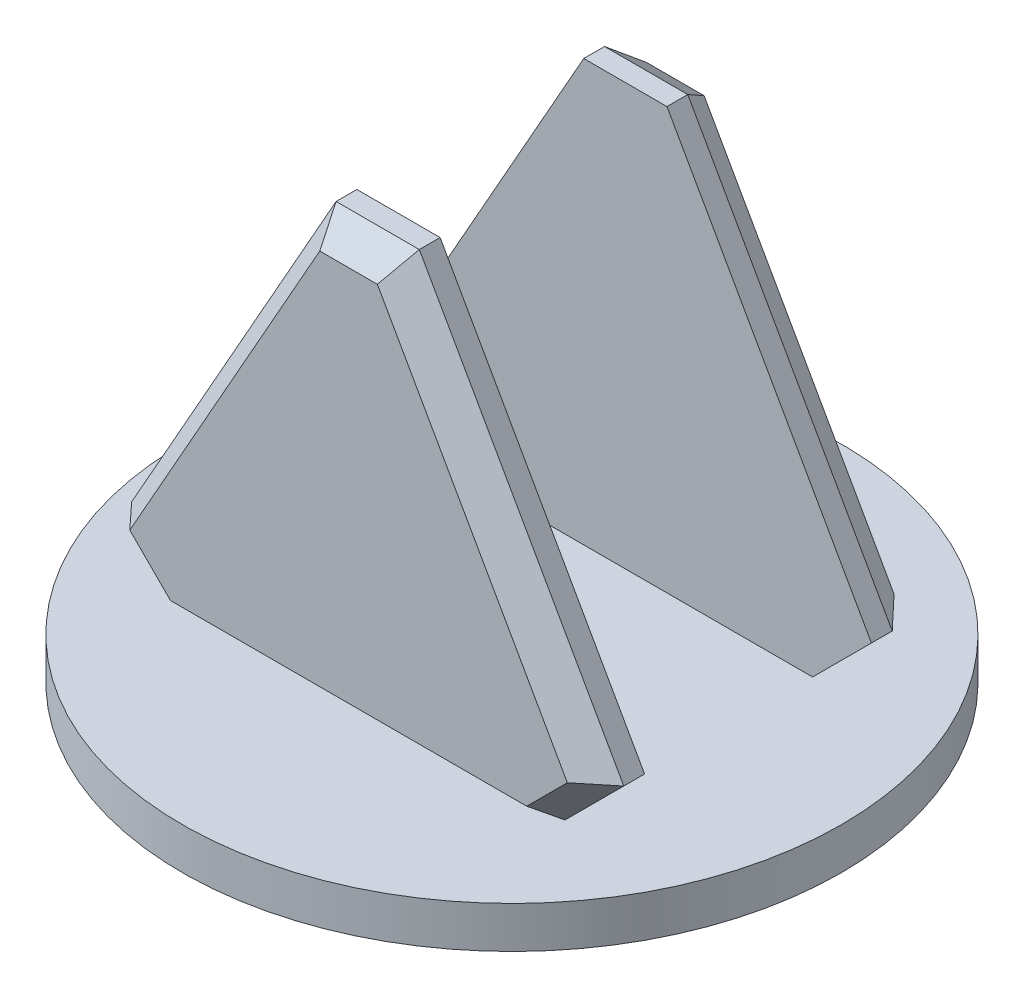
ISO-10303-21;
HEADER;
FILE_DESCRIPTION(('STEP AP214'),'2;1');
FILE_NAME('part.step','',(''),(''),'','','');
FILE_SCHEMA(('AUTOMOTIVE_DESIGN { 1 0 10303 214 1 1 1 1 }'));
ENDSEC;
DATA;
#1=APPLICATION_CONTEXT('core data for automotive mechanical design processes');
#2=APPLICATION_PROTOCOL_DEFINITION('international standard','automotive_design',2000,#1);
#3=PRODUCT_CONTEXT('',#1,'mechanical');
#4=PRODUCT('Part','Part','',(#3));
#5=PRODUCT_RELATED_PRODUCT_CATEGORY('part','',(#4));
#6=PRODUCT_DEFINITION_FORMATION('','',#4);
#7=PRODUCT_DEFINITION_CONTEXT('part definition',#1,'design');
#8=PRODUCT_DEFINITION('design','',#6,#7);
#9=PRODUCT_DEFINITION_SHAPE('','',#8);
#10=(LENGTH_UNIT() NAMED_UNIT(*) SI_UNIT(.MILLI.,.METRE.));
#11=(NAMED_UNIT(*) PLANE_ANGLE_UNIT() SI_UNIT($,.RADIAN.));
#12=(NAMED_UNIT(*) SI_UNIT($,.STERADIAN.) SOLID_ANGLE_UNIT());
#13=UNCERTAINTY_MEASURE_WITH_UNIT(LENGTH_MEASURE(1.E-05),#10,'distance_accuracy_value','');
#14=(GEOMETRIC_REPRESENTATION_CONTEXT(3) GLOBAL_UNCERTAINTY_ASSIGNED_CONTEXT((#13)) GLOBAL_UNIT_ASSIGNED_CONTEXT((#10,
#11,#12)) REPRESENTATION_CONTEXT('',''));
#15=CARTESIAN_POINT('',(0.,0.,0.));
#16=DIRECTION('',(0.,0.,1.));
#17=DIRECTION('',(1.,0.,0.));
#18=AXIS2_PLACEMENT_3D('',#15,#16,#17);
#19=CARTESIAN_POINT('',(0.,0.,-32.26));
#20=DIRECTION('',(0.,-1.,0.));
#21=DIRECTION('',(1.,0.,0.));
#22=AXIS2_PLACEMENT_3D('',#19,#20,#21);
#23=PLANE('',#22);
#24=CARTESIAN_POINT('',(0.,0.,-32.26));
#25=DIRECTION('',(0.,-1.,0.));
#26=DIRECTION('',(1.,0.,0.));
#27=AXIS2_PLACEMENT_3D('',#24,#25,#26);
#28=CIRCLE('',#27,79.2087466655229);
#29=CARTESIAN_POINT('',(79.2087466655229,0.,-32.26));
#30=VERTEX_POINT('',#29);
#31=EDGE_CURVE('E376',#30,#30,#28,.T.);
#32=ORIENTED_EDGE('',*,*,#31,.F.);
#33=EDGE_LOOP('',(#32));
#34=FACE_BOUND('',#33,.T.);
#35=DIRECTION('',(1.,0.,0.));
#36=VECTOR('',#35,1.);
#37=CARTESIAN_POINT('',(45.,0.,0.));
#38=LINE('',#37,#36);
#39=CARTESIAN_POINT('',(-45.,0.,0.));
#40=VERTEX_POINT('',#39);
#41=CARTESIAN_POINT('',(45.,0.,0.));
#42=VERTEX_POINT('',#41);
#43=EDGE_CURVE('E152',#40,#42,#38,.T.);
#44=ORIENTED_EDGE('',*,*,#43,.F.);
#45=DIRECTION('',(0.,0.,1.));
#46=VECTOR('',#45,1.);
#47=CARTESIAN_POINT('',(-45.,0.,-5.));
#48=LINE('',#47,#46);
#49=CARTESIAN_POINT('',(-45.,0.,-5.));
#50=VERTEX_POINT('',#49);
#51=EDGE_CURVE('E169',#50,#40,#48,.T.);
#52=ORIENTED_EDGE('',*,*,#51,.F.);
#53=DIRECTION('',(1.,0.,0.));
#54=VECTOR('',#53,1.);
#55=CARTESIAN_POINT('',(45.,0.,-5.));
#56=LINE('',#55,#54);
#57=CARTESIAN_POINT('',(45.,0.,-5.));
#58=VERTEX_POINT('',#57);
#59=EDGE_CURVE('E134',#50,#58,#56,.T.);
#60=ORIENTED_EDGE('',*,*,#59,.T.);
#61=DIRECTION('',(0.,0.,1.));
#62=VECTOR('',#61,1.);
#63=CARTESIAN_POINT('',(45.,0.,-5.));
#64=LINE('',#63,#62);
#65=EDGE_CURVE('E120',#58,#42,#64,.T.);
#66=ORIENTED_EDGE('',*,*,#65,.T.);
#67=EDGE_LOOP('',(#44,#52,#60,#66));
#68=FACE_BOUND('',#67,.T.);
#69=DIRECTION('',(1.,0.,0.));
#70=VECTOR('',#69,1.);
#71=CARTESIAN_POINT('',(45.,0.,-59.52));
#72=LINE('',#71,#70);
#73=CARTESIAN_POINT('',(-45.,0.,-59.52));
#74=VERTEX_POINT('',#73);
#75=CARTESIAN_POINT('',(45.,0.,-59.52));
#76=VERTEX_POINT('',#75);
#77=EDGE_CURVE('E367',#74,#76,#72,.T.);
#78=ORIENTED_EDGE('',*,*,#77,.F.);
#79=DIRECTION('',(0.,0.,-1.));
#80=VECTOR('',#79,1.);
#81=CARTESIAN_POINT('',(-45.,0.,-59.52));
#82=LINE('',#81,#80);
#83=CARTESIAN_POINT('',(-45.,0.,-64.52));
#84=VERTEX_POINT('',#83);
#85=EDGE_CURVE('E874',#74,#84,#82,.T.);
#86=ORIENTED_EDGE('',*,*,#85,.T.);
#87=DIRECTION('',(1.,0.,0.));
#88=VECTOR('',#87,1.);
#89=CARTESIAN_POINT('',(45.,0.,-64.52));
#90=LINE('',#89,#88);
#91=CARTESIAN_POINT('',(45.,0.,-64.52));
#92=VERTEX_POINT('',#91);
#93=EDGE_CURVE('E864',#84,#92,#90,.T.);
#94=ORIENTED_EDGE('',*,*,#93,.T.);
#95=DIRECTION('',(0.,0.,-1.));
#96=VECTOR('',#95,1.);
#97=CARTESIAN_POINT('',(45.,0.,-59.52));
#98=LINE('',#97,#96);
#99=EDGE_CURVE('E63',#76,#92,#98,.T.);
#100=ORIENTED_EDGE('',*,*,#99,.F.);
#101=EDGE_LOOP('',(#78,#86,#94,#100));
#102=FACE_BOUND('',#101,.T.);
#103=ADVANCED_FACE('F45',(#34,#68,#102),#23,.F.);
#104=CARTESIAN_POINT('',(-59.1421356237309,14.142135623731,-5.));
#105=DIRECTION('',(-0.870921954387351,0.491421356237309,0.));
#106=DIRECTION('',(-0.491421356237309,-0.870921954387352,0.));
#107=AXIS2_PLACEMENT_3D('',#104,#105,#106);
#108=PLANE('',#107);
#109=DIRECTION('',(-0.491421356237309,-0.870921954387351,0.));
#110=VECTOR('',#109,1.);
#111=CARTESIAN_POINT('',(-59.1421356237309,14.142135623731,0.));
#112=LINE('',#111,#110);
#113=CARTESIAN_POINT('',(-10.,101.234331062466,0.));
#114=VERTEX_POINT('',#113);
#115=CARTESIAN_POINT('',(-59.1421356237309,14.142135623731,0.));
#116=VERTEX_POINT('',#115);
#117=EDGE_CURVE('E143',#114,#116,#112,.T.);
#118=ORIENTED_EDGE('',*,*,#117,.F.);
#119=DIRECTION('',(0.,0.,1.));
#120=VECTOR('',#119,1.);
#121=CARTESIAN_POINT('',(-10.,101.234331062466,-5.));
#122=LINE('',#121,#120);
#123=CARTESIAN_POINT('',(-10.,101.234331062466,-5.));
#124=VERTEX_POINT('',#123);
#125=EDGE_CURVE('E11',#124,#114,#122,.T.);
#126=ORIENTED_EDGE('',*,*,#125,.F.);
#127=DIRECTION('',(-0.491421356237309,-0.870921954387351,0.));
#128=VECTOR('',#127,1.);
#129=CARTESIAN_POINT('',(-59.1421356237309,14.142135623731,-5.));
#130=LINE('',#129,#128);
#131=CARTESIAN_POINT('',(-59.1421356237309,14.142135623731,-5.));
#132=VERTEX_POINT('',#131);
#133=EDGE_CURVE('E164',#124,#132,#130,.T.);
#134=ORIENTED_EDGE('',*,*,#133,.T.);
#135=DIRECTION('',(0.,0.,1.));
#136=VECTOR('',#135,1.);
#137=CARTESIAN_POINT('',(-59.1421356237309,14.142135623731,-5.));
#138=LINE('',#137,#136);
#139=EDGE_CURVE('E49',#132,#116,#138,.T.);
#140=ORIENTED_EDGE('',*,*,#139,.T.);
#141=EDGE_LOOP('',(#118,#126,#134,#140));
#142=FACE_BOUND('',#141,.T.);
#143=ADVANCED_FACE('F47',(#142),#108,.T.);
#144=CARTESIAN_POINT('',(-10.,101.234331062466,-5.));
#145=DIRECTION('',(0.,1.,0.));
#146=DIRECTION('',(0.,0.,1.));
#147=AXIS2_PLACEMENT_3D('',#144,#145,#146);
#148=PLANE('',#147);
#149=DIRECTION('',(-1.,0.,0.));
#150=VECTOR('',#149,1.);
#151=CARTESIAN_POINT('',(-10.,101.234331062466,0.));
#152=LINE('',#151,#150);
#153=CARTESIAN_POINT('',(9.99999999999998,101.234331062466,0.));
#154=VERTEX_POINT('',#153);
#155=EDGE_CURVE('E161',#154,#114,#152,.T.);
#156=ORIENTED_EDGE('',*,*,#155,.F.);
#157=DIRECTION('',(0.,0.,1.));
#158=VECTOR('',#157,1.);
#159=CARTESIAN_POINT('',(9.99999999999998,101.234331062466,-5.));
#160=LINE('',#159,#158);
#161=CARTESIAN_POINT('',(9.99999999999998,101.234331062466,-5.));
#162=VERTEX_POINT('',#161);
#163=EDGE_CURVE('E55',#162,#154,#160,.T.);
#164=ORIENTED_EDGE('',*,*,#163,.F.);
#165=DIRECTION('',(-1.,0.,0.));
#166=VECTOR('',#165,1.);
#167=CARTESIAN_POINT('',(-10.,101.234331062466,-5.));
#168=LINE('',#167,#166);
#169=EDGE_CURVE('E128',#162,#124,#168,.T.);
#170=ORIENTED_EDGE('',*,*,#169,.T.);
#171=ORIENTED_EDGE('',*,*,#125,.T.);
#172=EDGE_LOOP('',(#156,#164,#170,#171));
#173=FACE_BOUND('',#172,.T.);
#174=ADVANCED_FACE('F404',(#173),#148,.T.);
#175=CARTESIAN_POINT('',(9.99999999999998,101.234331062466,-5.));
#176=DIRECTION('',(0.870921954387351,0.491421356237309,0.));
#177=DIRECTION('',(-0.49142135623731,0.870921954387351,0.));
#178=AXIS2_PLACEMENT_3D('',#175,#176,#177);
#179=PLANE('',#178);
#180=DIRECTION('',(-0.491421356237309,0.870921954387351,0.));
#181=VECTOR('',#180,1.);
#182=CARTESIAN_POINT('',(9.99999999999998,101.234331062466,0.));
#183=LINE('',#182,#181);
#184=CARTESIAN_POINT('',(59.1421356237309,14.142135623731,0.));
#185=VERTEX_POINT('',#184);
#186=EDGE_CURVE('E114',#185,#154,#183,.T.);
#187=ORIENTED_EDGE('',*,*,#186,.F.);
#188=DIRECTION('',(0.,0.,1.));
#189=VECTOR('',#188,1.);
#190=CARTESIAN_POINT('',(59.1421356237309,14.142135623731,-5.));
#191=LINE('',#190,#189);
#192=CARTESIAN_POINT('',(59.1421356237309,14.142135623731,-5.));
#193=VERTEX_POINT('',#192);
#194=EDGE_CURVE('E108',#193,#185,#191,.T.);
#195=ORIENTED_EDGE('',*,*,#194,.F.);
#196=DIRECTION('',(-0.491421356237309,0.870921954387351,0.));
#197=VECTOR('',#196,1.);
#198=CARTESIAN_POINT('',(9.99999999999998,101.234331062466,-5.));
#199=LINE('',#198,#197);
#200=EDGE_CURVE('E111',#193,#162,#199,.T.);
#201=ORIENTED_EDGE('',*,*,#200,.T.);
#202=ORIENTED_EDGE('',*,*,#163,.T.);
#203=EDGE_LOOP('',(#187,#195,#201,#202));
#204=FACE_BOUND('',#203,.T.);
#205=ADVANCED_FACE('F110',(#204),#179,.T.);
#206=CARTESIAN_POINT('',(59.1421356237309,14.142135623731,-5.));
#207=DIRECTION('',(0.707106781186549,-0.707106781186546,0.));
#208=DIRECTION('',(0.707106781186546,0.707106781186549,0.));
#209=AXIS2_PLACEMENT_3D('',#206,#207,#208);
#210=PLANE('',#209);
#211=DIRECTION('',(0.707106781186546,0.707106781186549,0.));
#212=VECTOR('',#211,1.);
#213=CARTESIAN_POINT('',(59.1421356237309,14.142135623731,0.));
#214=LINE('',#213,#212);
#215=EDGE_CURVE('E156',#42,#185,#214,.T.);
#216=ORIENTED_EDGE('',*,*,#215,.F.);
#217=ORIENTED_EDGE('',*,*,#65,.F.);
#218=DIRECTION('',(0.707106781186546,0.707106781186549,0.));
#219=VECTOR('',#218,1.);
#220=CARTESIAN_POINT('',(59.1421356237309,14.142135623731,-5.));
#221=LINE('',#220,#219);
#222=EDGE_CURVE('E125',#58,#193,#221,.T.);
#223=ORIENTED_EDGE('',*,*,#222,.T.);
#224=ORIENTED_EDGE('',*,*,#194,.T.);
#225=EDGE_LOOP('',(#216,#217,#223,#224));
#226=FACE_BOUND('',#225,.T.);
#227=ADVANCED_FACE('F131',(#226),#210,.T.);
#228=CARTESIAN_POINT('',(-45.,0.,-5.));
#229=DIRECTION('',(-0.707106781186549,-0.707106781186546,0.));
#230=DIRECTION('',(0.707106781186546,-0.707106781186549,0.));
#231=AXIS2_PLACEMENT_3D('',#228,#229,#230);
#232=PLANE('',#231);
#233=DIRECTION('',(0.707106781186546,-0.707106781186549,0.));
#234=VECTOR('',#233,1.);
#235=CARTESIAN_POINT('',(-45.,0.,0.));
#236=LINE('',#235,#234);
#237=EDGE_CURVE('E147',#116,#40,#236,.T.);
#238=ORIENTED_EDGE('',*,*,#237,.F.);
#239=ORIENTED_EDGE('',*,*,#139,.F.);
#240=DIRECTION('',(0.707106781186546,-0.707106781186549,0.));
#241=VECTOR('',#240,1.);
#242=CARTESIAN_POINT('',(-45.,0.,-5.));
#243=LINE('',#242,#241);
#244=EDGE_CURVE('E137',#132,#50,#243,.T.);
#245=ORIENTED_EDGE('',*,*,#244,.T.);
#246=ORIENTED_EDGE('',*,*,#51,.T.);
#247=EDGE_LOOP('',(#238,#239,#245,#246));
#248=FACE_BOUND('',#247,.T.);
#249=ADVANCED_FACE('F175',(#248),#232,.T.);
#250=CARTESIAN_POINT('',(0.,0.,-5.));
#251=DIRECTION('',(0.,0.,1.));
#252=DIRECTION('',(1.,0.,0.));
#253=AXIS2_PLACEMENT_3D('',#250,#251,#252);
#254=PLANE('',#253);
#255=CARTESIAN_POINT('',(0.,81.2343310624661,-5.));
#256=DIRECTION('',(0.,0.,-1.));
#257=DIRECTION('',(-1.,0.,0.));
#258=AXIS2_PLACEMENT_3D('',#255,#256,#257);
#259=CIRCLE('',#258,1.75);
#260=CARTESIAN_POINT('',(-1.75,81.2343310624661,-5.));
#261=VERTEX_POINT('',#260);
#262=EDGE_CURVE('E375',#261,#261,#259,.T.);
#263=ORIENTED_EDGE('',*,*,#262,.F.);
#264=EDGE_LOOP('',(#263));
#265=FACE_BOUND('',#264,.T.);
#266=ORIENTED_EDGE('',*,*,#133,.F.);
#267=ORIENTED_EDGE('',*,*,#169,.F.);
#268=ORIENTED_EDGE('',*,*,#200,.F.);
#269=ORIENTED_EDGE('',*,*,#222,.F.);
#270=ORIENTED_EDGE('',*,*,#59,.F.);
#271=ORIENTED_EDGE('',*,*,#244,.F.);
#272=EDGE_LOOP('',(#266,#267,#268,#269,#270,#271));
#273=FACE_BOUND('',#272,.T.);
#274=ADVANCED_FACE('F124',(#265,#273),#254,.F.);
#275=CARTESIAN_POINT('',(-59.1421356237309,14.142135623731,0.));
#276=DIRECTION('',(-0.695549199253527,0.392466545486716,0.601815023152049));
#277=DIRECTION('',(0.654312987914903,0.,0.756223851677446));
#278=AXIS2_PLACEMENT_3D('',#275,#276,#277);
#279=PLANE('',#278);
#280=ORIENTED_EDGE('',*,*,#117,.T.);
#281=DIRECTION('',(-0.680988559504797,-0.0930777136887457,-0.726354679917502));
#282=VECTOR('',#281,1.);
#283=CARTESIAN_POINT('',(-53.4801822856834,14.9160130470185,6.03914154968465));
#284=LINE('',#283,#282);
#285=CARTESIAN_POINT('',(-52.5793364178733,15.0391409213291,7.));
#286=VERTEX_POINT('',#285);
#287=EDGE_CURVE('E148',#286,#116,#284,.T.);
#288=ORIENTED_EDGE('',*,*,#287,.F.);
#289=DIRECTION('',(0.491421356237309,0.870921954387351,0.));
#290=VECTOR('',#289,1.);
#291=CARTESIAN_POINT('',(-54.5481282613667,11.5499477506335,7.));
#292=LINE('',#291,#290);
#293=CARTESIAN_POINT('',(-6.91971196258424,95.9594527117465,7.));
#294=VERTEX_POINT('',#293);
#295=EDGE_CURVE('E195',#294,#286,#292,.F.);
#296=ORIENTED_EDGE('',*,*,#295,.F.);
#297=DIRECTION('',(-0.331554129183276,0.567774077254084,-0.753461649070338));
#298=VECTOR('',#297,1.);
#299=CARTESIAN_POINT('',(0.99281405784804,82.4095470867845,24.9813320930511));
#300=LINE('',#299,#298);
#301=EDGE_CURVE('E194',#294,#114,#300,.T.);
#302=ORIENTED_EDGE('',*,*,#301,.T.);
#303=EDGE_LOOP('',(#280,#288,#296,#302));
#304=FACE_BOUND('',#303,.T.);
#305=ADVANCED_FACE('F192',(#304),#279,.T.);
#306=CARTESIAN_POINT('',(-45.,0.,0.));
#307=DIRECTION('',(-0.564720584850819,-0.564720584850817,0.601815023152049));
#308=DIRECTION('',(0.729223342778639,0.,0.68427576045535));
#309=AXIS2_PLACEMENT_3D('',#306,#307,#308);
#310=PLANE('',#309);
#311=ORIENTED_EDGE('',*,*,#237,.T.);
#312=DIRECTION('',(-0.241877993294069,-0.583945131850128,-0.774921363332159));
#313=VECTOR('',#312,1.);
#314=CARTESIAN_POINT('',(-39.7345532724031,12.7119129017174,16.8692781891138));
#315=LINE('',#314,#313);
#316=CARTESIAN_POINT('',(-42.8150738472637,5.27487835071957,7.));
#317=VERTEX_POINT('',#316);
#318=EDGE_CURVE('E189',#317,#40,#315,.T.);
#319=ORIENTED_EDGE('',*,*,#318,.F.);
#320=DIRECTION('',(-0.707106781186546,0.707106781186549,0.));
#321=VECTOR('',#320,1.);
#322=CARTESIAN_POINT('',(-41.2700977482721,3.72990225172791,7.));
#323=LINE('',#322,#321);
#324=EDGE_CURVE('E184',#286,#317,#323,.F.);
#325=ORIENTED_EDGE('',*,*,#324,.F.);
#326=ORIENTED_EDGE('',*,*,#287,.T.);
#327=EDGE_LOOP('',(#311,#319,#325,#326));
#328=FACE_BOUND('',#327,.T.);
#329=ADVANCED_FACE('F181',(#328),#310,.T.);
#330=CARTESIAN_POINT('',(45.,0.,0.));
#331=DIRECTION('',(0.,-0.798635510047292,0.601815023152049));
#332=DIRECTION('',(0.,-0.601815023152049,-0.798635510047293));
#333=AXIS2_PLACEMENT_3D('',#330,#331,#332);
#334=PLANE('',#333);
#335=ORIENTED_EDGE('',*,*,#43,.T.);
#336=DIRECTION('',(0.241877993294069,-0.583945131850128,-0.774921363332159));
#337=VECTOR('',#336,1.);
#338=CARTESIAN_POINT('',(43.8299007272007,2.824869533715,3.74872848646973));
#339=LINE('',#338,#337);
#340=CARTESIAN_POINT('',(42.8150738472637,5.27487835071958,7.));
#341=VERTEX_POINT('',#340);
#342=EDGE_CURVE('E217',#341,#42,#339,.T.);
#343=ORIENTED_EDGE('',*,*,#342,.F.);
#344=DIRECTION('',(-1.,0.,0.));
#345=VECTOR('',#344,1.);
#346=CARTESIAN_POINT('',(45.,5.27487835071958,7.));
#347=LINE('',#346,#345);
#348=EDGE_CURVE('E228',#317,#341,#347,.F.);
#349=ORIENTED_EDGE('',*,*,#348,.F.);
#350=ORIENTED_EDGE('',*,*,#318,.T.);
#351=EDGE_LOOP('',(#335,#343,#349,#350));
#352=FACE_BOUND('',#351,.T.);
#353=ADVANCED_FACE('F246',(#352),#334,.T.);
#354=CARTESIAN_POINT('',(59.1421356237309,14.142135623731,0.));
#355=DIRECTION('',(0.564720584850819,-0.564720584850816,0.601815023152049));
#356=DIRECTION('',(0.729223342778639,0.,-0.68427576045535));
#357=AXIS2_PLACEMENT_3D('',#354,#355,#356);
#358=PLANE('',#357);
#359=ORIENTED_EDGE('',*,*,#215,.T.);
#360=DIRECTION('',(0.680988559504797,-0.0930777136887455,-0.726354679917503));
#361=VECTOR('',#360,1.);
#362=CARTESIAN_POINT('',(30.8323689334935,18.0115227401684,30.1957077484232));
#363=LINE('',#362,#361);
#364=CARTESIAN_POINT('',(52.5793364178733,15.0391409213292,7.));
#365=VERTEX_POINT('',#364);
#366=EDGE_CURVE('E207',#365,#185,#363,.T.);
#367=ORIENTED_EDGE('',*,*,#366,.F.);
#368=DIRECTION('',(-0.707106781186546,-0.707106781186549,0.));
#369=VECTOR('',#368,1.);
#370=CARTESIAN_POINT('',(55.412233372003,17.8720378754589,7.));
#371=LINE('',#370,#369);
#372=EDGE_CURVE('E232',#341,#365,#371,.F.);
#373=ORIENTED_EDGE('',*,*,#372,.F.);
#374=ORIENTED_EDGE('',*,*,#342,.T.);
#375=EDGE_LOOP('',(#359,#367,#373,#374));
#376=FACE_BOUND('',#375,.T.);
#377=ADVANCED_FACE('F254',(#376),#358,.T.);
#378=CARTESIAN_POINT('',(9.99999999999998,101.234331062466,0.));
#379=DIRECTION('',(0.695549199253527,0.392466545486716,0.601815023152049));
#380=DIRECTION('',(0.654312987914903,0.,-0.756223851677446));
#381=AXIS2_PLACEMENT_3D('',#378,#379,#380);
#382=PLANE('',#381);
#383=ORIENTED_EDGE('',*,*,#186,.T.);
#384=DIRECTION('',(0.331554129183276,0.567774077254084,-0.753461649070338));
#385=VECTOR('',#384,1.);
#386=CARTESIAN_POINT('',(7.80143718843037,97.4693742673298,4.99626641861022));
#387=LINE('',#386,#385);
#388=CARTESIAN_POINT('',(6.91971196258419,95.9594527117465,7.));
#389=VERTEX_POINT('',#388);
#390=EDGE_CURVE('E201',#389,#154,#387,.T.);
#391=ORIENTED_EDGE('',*,*,#390,.F.);
#392=DIRECTION('',(0.491421356237309,-0.870921954387351,0.));
#393=VECTOR('',#392,1.);
#394=CARTESIAN_POINT('',(5.40599263763577,98.6421431893687,7.));
#395=LINE('',#394,#393);
#396=EDGE_CURVE('E210',#365,#389,#395,.F.);
#397=ORIENTED_EDGE('',*,*,#396,.F.);
#398=ORIENTED_EDGE('',*,*,#366,.T.);
#399=EDGE_LOOP('',(#383,#391,#397,#398));
#400=FACE_BOUND('',#399,.T.);
#401=ADVANCED_FACE('F258',(#400),#382,.T.);
#402=CARTESIAN_POINT('',(-10.,101.234331062466,0.));
#403=DIRECTION('',(0.,0.798635510047292,0.601815023152049));
#404=DIRECTION('',(0.,-0.601815023152049,0.798635510047292));
#405=AXIS2_PLACEMENT_3D('',#402,#403,#404);
#406=PLANE('',#405);
#407=ORIENTED_EDGE('',*,*,#155,.T.);
#408=ORIENTED_EDGE('',*,*,#301,.F.);
#409=DIRECTION('',(1.,0.,0.));
#410=VECTOR('',#409,1.);
#411=CARTESIAN_POINT('',(-10.,95.9594527117465,7.));
#412=LINE('',#411,#410);
#413=EDGE_CURVE('E202',#389,#294,#412,.F.);
#414=ORIENTED_EDGE('',*,*,#413,.F.);
#415=ORIENTED_EDGE('',*,*,#390,.T.);
#416=EDGE_LOOP('',(#407,#408,#414,#415));
#417=FACE_BOUND('',#416,.T.);
#418=ADVANCED_FACE('F422',(#417),#406,.T.);
#419=CARTESIAN_POINT('',(0.,0.,7.));
#420=DIRECTION('',(0.,0.,1.));
#421=DIRECTION('',(1.,0.,0.));
#422=AXIS2_PLACEMENT_3D('',#419,#420,#421);
#423=PLANE('',#422);
#424=ORIENTED_EDGE('',*,*,#295,.T.);
#425=ORIENTED_EDGE('',*,*,#324,.T.);
#426=ORIENTED_EDGE('',*,*,#348,.T.);
#427=ORIENTED_EDGE('',*,*,#372,.T.);
#428=ORIENTED_EDGE('',*,*,#396,.T.);
#429=ORIENTED_EDGE('',*,*,#413,.T.);
#430=EDGE_LOOP('',(#424,#425,#426,#427,#428,#429));
#431=FACE_BOUND('',#430,.T.);
#432=ADVANCED_FACE('F263',(#431),#423,.T.);
#433=CARTESIAN_POINT('',(0.,81.2343310624661,-2.));
#434=DIRECTION('',(0.,0.,-1.));
#435=DIRECTION('',(-1.,0.,0.));
#436=AXIS2_PLACEMENT_3D('',#433,#434,#435);
#437=CYLINDRICAL_SURFACE('',#436,1.75);
#438=CARTESIAN_POINT('',(0.,81.2343310624661,-2.));
#439=DIRECTION('',(0.,0.,-1.));
#440=DIRECTION('',(-1.,0.,0.));
#441=AXIS2_PLACEMENT_3D('',#438,#439,#440);
#442=CIRCLE('',#441,1.75);
#443=CARTESIAN_POINT('',(-1.75,81.2343310624661,-2.));
#444=VERTEX_POINT('',#443);
#445=EDGE_CURVE('E225',#444,#444,#442,.T.);
#446=ORIENTED_EDGE('',*,*,#445,.F.);
#447=EDGE_LOOP('',(#446));
#448=FACE_BOUND('',#447,.T.);
#449=ORIENTED_EDGE('',*,*,#262,.T.);
#450=EDGE_LOOP('',(#449));
#451=FACE_BOUND('',#450,.T.);
#452=ADVANCED_FACE('F387',(#448,#451),#437,.F.);
#453=CARTESIAN_POINT('',(0.,81.2343310624661,-2.));
#454=DIRECTION('',(0.,0.,-1.));
#455=DIRECTION('',(-1.,0.,0.));
#456=AXIS2_PLACEMENT_3D('',#453,#454,#455);
#457=PLANE('',#456);
#458=ORIENTED_EDGE('',*,*,#445,.T.);
#459=EDGE_LOOP('',(#458));
#460=FACE_BOUND('',#459,.T.);
#461=ADVANCED_FACE('F413',(#460),#457,.T.);
#462=CARTESIAN_POINT('',(0.,-10.,-32.26));
#463=DIRECTION('',(0.,1.,0.));
#464=DIRECTION('',(-1.,0.,0.));
#465=AXIS2_PLACEMENT_3D('',#462,#463,#464);
#466=CYLINDRICAL_SURFACE('',#465,79.2087466655229);
#467=CARTESIAN_POINT('',(0.,-10.,-32.26));
#468=DIRECTION('',(0.,-1.,0.));
#469=DIRECTION('',(1.,0.,0.));
#470=AXIS2_PLACEMENT_3D('',#467,#468,#469);
#471=CIRCLE('',#470,79.2087466655229);
#472=CARTESIAN_POINT('',(79.2087466655229,-9.99999999999999,-32.26));
#473=VERTEX_POINT('',#472);
#474=EDGE_CURVE('E371',#473,#473,#471,.T.);
#475=ORIENTED_EDGE('',*,*,#474,.F.);
#476=EDGE_LOOP('',(#475));
#477=FACE_BOUND('',#476,.T.);
#478=ORIENTED_EDGE('',*,*,#31,.T.);
#479=EDGE_LOOP('',(#478));
#480=FACE_BOUND('',#479,.T.);
#481=ADVANCED_FACE('F410',(#477,#480),#466,.T.);
#482=CARTESIAN_POINT('',(0.,-10.,-32.26));
#483=DIRECTION('',(0.,-1.,0.));
#484=DIRECTION('',(1.,0.,0.));
#485=AXIS2_PLACEMENT_3D('',#482,#483,#484);
#486=PLANE('',#485);
#487=ORIENTED_EDGE('',*,*,#474,.T.);
#488=EDGE_LOOP('',(#487));
#489=FACE_BOUND('',#488,.T.);
#490=ADVANCED_FACE('F408',(#489),#486,.T.);
#491=CARTESIAN_POINT('',(-59.1421356237309,14.142135623731,-59.52));
#492=DIRECTION('',(0.870921954387351,-0.491421356237309,0.));
#493=DIRECTION('',(0.491421356237309,0.870921954387352,0.));
#494=AXIS2_PLACEMENT_3D('',#491,#492,#493);
#495=PLANE('',#494);
#496=DIRECTION('',(-0.491421356237309,-0.870921954387351,0.));
#497=VECTOR('',#496,1.);
#498=CARTESIAN_POINT('',(-59.1421356237309,14.142135623731,-64.52));
#499=LINE('',#498,#497);
#500=CARTESIAN_POINT('',(-10.,101.234331062466,-64.52));
#501=VERTEX_POINT('',#500);
#502=CARTESIAN_POINT('',(-59.1421356237309,14.142135623731,-64.52));
#503=VERTEX_POINT('',#502);
#504=EDGE_CURVE('E333',#501,#503,#499,.T.);
#505=ORIENTED_EDGE('',*,*,#504,.T.);
#506=DIRECTION('',(0.,0.,-1.));
#507=VECTOR('',#506,1.);
#508=CARTESIAN_POINT('',(-59.1421356237309,14.142135623731,-59.52));
#509=LINE('',#508,#507);
#510=CARTESIAN_POINT('',(-59.1421356237309,14.142135623731,-59.52));
#511=VERTEX_POINT('',#510);
#512=EDGE_CURVE('E380',#511,#503,#509,.T.);
#513=ORIENTED_EDGE('',*,*,#512,.F.);
#514=DIRECTION('',(-0.491421356237309,-0.870921954387351,0.));
#515=VECTOR('',#514,1.);
#516=CARTESIAN_POINT('',(-59.1421356237309,14.142135623731,-59.52));
#517=LINE('',#516,#515);
#518=CARTESIAN_POINT('',(-10.,101.234331062466,-59.52));
#519=VERTEX_POINT('',#518);
#520=EDGE_CURVE('E359',#519,#511,#517,.T.);
#521=ORIENTED_EDGE('',*,*,#520,.F.);
#522=DIRECTION('',(0.,0.,-1.));
#523=VECTOR('',#522,1.);
#524=CARTESIAN_POINT('',(-10.,101.234331062466,-59.52));
#525=LINE('',#524,#523);
#526=EDGE_CURVE('E350',#519,#501,#525,.T.);
#527=ORIENTED_EDGE('',*,*,#526,.T.);
#528=EDGE_LOOP('',(#505,#513,#521,#527));
#529=FACE_BOUND('',#528,.T.);
#530=ADVANCED_FACE('F357',(#529),#495,.F.);
#531=CARTESIAN_POINT('',(-45.,0.,-59.52));
#532=DIRECTION('',(0.707106781186549,0.707106781186546,0.));
#533=DIRECTION('',(-0.707106781186546,0.707106781186549,0.));
#534=AXIS2_PLACEMENT_3D('',#531,#532,#533);
#535=PLANE('',#534);
#536=DIRECTION('',(0.707106781186546,-0.707106781186549,0.));
#537=VECTOR('',#536,1.);
#538=CARTESIAN_POINT('',(-45.,0.,-64.52));
#539=LINE('',#538,#537);
#540=EDGE_CURVE('E848',#503,#84,#539,.T.);
#541=ORIENTED_EDGE('',*,*,#540,.T.);
#542=ORIENTED_EDGE('',*,*,#85,.F.);
#543=DIRECTION('',(0.707106781186546,-0.707106781186549,0.));
#544=VECTOR('',#543,1.);
#545=CARTESIAN_POINT('',(-45.,0.,-59.52));
#546=LINE('',#545,#544);
#547=EDGE_CURVE('E361',#511,#74,#546,.T.);
#548=ORIENTED_EDGE('',*,*,#547,.F.);
#549=ORIENTED_EDGE('',*,*,#512,.T.);
#550=EDGE_LOOP('',(#541,#542,#548,#549));
#551=FACE_BOUND('',#550,.T.);
#552=ADVANCED_FACE('F480',(#551),#535,.F.);
#553=CARTESIAN_POINT('',(59.1421356237309,14.142135623731,-59.52));
#554=DIRECTION('',(-0.707106781186549,0.707106781186546,0.));
#555=DIRECTION('',(-0.707106781186546,-0.707106781186549,0.));
#556=AXIS2_PLACEMENT_3D('',#553,#554,#555);
#557=PLANE('',#556);
#558=DIRECTION('',(0.707106781186546,0.707106781186549,0.));
#559=VECTOR('',#558,1.);
#560=CARTESIAN_POINT('',(59.1421356237309,14.142135623731,-64.52));
#561=LINE('',#560,#559);
#562=CARTESIAN_POINT('',(59.1421356237309,14.142135623731,-64.52));
#563=VERTEX_POINT('',#562);
#564=EDGE_CURVE('E861',#92,#563,#561,.T.);
#565=ORIENTED_EDGE('',*,*,#564,.T.);
#566=DIRECTION('',(0.,0.,-1.));
#567=VECTOR('',#566,1.);
#568=CARTESIAN_POINT('',(59.1421356237309,14.142135623731,-59.52));
#569=LINE('',#568,#567);
#570=CARTESIAN_POINT('',(59.1421356237309,14.142135623731,-59.52));
#571=VERTEX_POINT('',#570);
#572=EDGE_CURVE('E365',#571,#563,#569,.T.);
#573=ORIENTED_EDGE('',*,*,#572,.F.);
#574=DIRECTION('',(0.707106781186546,0.707106781186549,0.));
#575=VECTOR('',#574,1.);
#576=CARTESIAN_POINT('',(59.1421356237309,14.142135623731,-59.52));
#577=LINE('',#576,#575);
#578=EDGE_CURVE('E854',#76,#571,#577,.T.);
#579=ORIENTED_EDGE('',*,*,#578,.F.);
#580=ORIENTED_EDGE('',*,*,#99,.T.);
#581=EDGE_LOOP('',(#565,#573,#579,#580));
#582=FACE_BOUND('',#581,.T.);
#583=ADVANCED_FACE('F486',(#582),#557,.F.);
#584=CARTESIAN_POINT('',(9.99999999999998,101.234331062466,-59.52));
#585=DIRECTION('',(-0.870921954387351,-0.491421356237309,0.));
#586=DIRECTION('',(0.49142135623731,-0.870921954387351,0.));
#587=AXIS2_PLACEMENT_3D('',#584,#585,#586);
#588=PLANE('',#587);
#589=DIRECTION('',(-0.491421356237309,0.870921954387351,0.));
#590=VECTOR('',#589,1.);
#591=CARTESIAN_POINT('',(9.99999999999998,101.234331062466,-64.52));
#592=LINE('',#591,#590);
#593=CARTESIAN_POINT('',(9.99999999999998,101.234331062466,-64.52));
#594=VERTEX_POINT('',#593);
#595=EDGE_CURVE('E355',#563,#594,#592,.T.);
#596=ORIENTED_EDGE('',*,*,#595,.T.);
#597=DIRECTION('',(0.,0.,-1.));
#598=VECTOR('',#597,1.);
#599=CARTESIAN_POINT('',(9.99999999999998,101.234331062466,-59.52));
#600=LINE('',#599,#598);
#601=CARTESIAN_POINT('',(9.99999999999998,101.234331062466,-59.52));
#602=VERTEX_POINT('',#601);
#603=EDGE_CURVE('E353',#602,#594,#600,.T.);
#604=ORIENTED_EDGE('',*,*,#603,.F.);
#605=DIRECTION('',(-0.491421356237309,0.870921954387351,0.));
#606=VECTOR('',#605,1.);
#607=CARTESIAN_POINT('',(9.99999999999998,101.234331062466,-59.52));
#608=LINE('',#607,#606);
#609=EDGE_CURVE('E851',#571,#602,#608,.T.);
#610=ORIENTED_EDGE('',*,*,#609,.F.);
#611=ORIENTED_EDGE('',*,*,#572,.T.);
#612=EDGE_LOOP('',(#596,#604,#610,#611));
#613=FACE_BOUND('',#612,.T.);
#614=ADVANCED_FACE('F494',(#613),#588,.F.);
#615=CARTESIAN_POINT('',(-10.,101.234331062466,-59.52));
#616=DIRECTION('',(0.,-1.,0.));
#617=DIRECTION('',(0.,0.,-1.));
#618=AXIS2_PLACEMENT_3D('',#615,#616,#617);
#619=PLANE('',#618);
#620=DIRECTION('',(-1.,0.,0.));
#621=VECTOR('',#620,1.);
#622=CARTESIAN_POINT('',(-10.,101.234331062466,-64.52));
#623=LINE('',#622,#621);
#624=EDGE_CURVE('E325',#594,#501,#623,.T.);
#625=ORIENTED_EDGE('',*,*,#624,.T.);
#626=ORIENTED_EDGE('',*,*,#526,.F.);
#627=DIRECTION('',(-1.,0.,0.));
#628=VECTOR('',#627,1.);
#629=CARTESIAN_POINT('',(-10.,101.234331062466,-59.52));
#630=LINE('',#629,#628);
#631=EDGE_CURVE('E847',#602,#519,#630,.T.);
#632=ORIENTED_EDGE('',*,*,#631,.F.);
#633=ORIENTED_EDGE('',*,*,#603,.T.);
#634=EDGE_LOOP('',(#625,#626,#632,#633));
#635=FACE_BOUND('',#634,.T.);
#636=ADVANCED_FACE('F348',(#635),#619,.F.);
#637=CARTESIAN_POINT('',(0.,0.,-59.52));
#638=DIRECTION('',(0.,0.,-1.));
#639=DIRECTION('',(1.,0.,0.));
#640=AXIS2_PLACEMENT_3D('',#637,#638,#639);
#641=PLANE('',#640);
#642=ORIENTED_EDGE('',*,*,#520,.T.);
#643=ORIENTED_EDGE('',*,*,#547,.T.);
#644=ORIENTED_EDGE('',*,*,#77,.T.);
#645=ORIENTED_EDGE('',*,*,#578,.T.);
#646=ORIENTED_EDGE('',*,*,#609,.T.);
#647=ORIENTED_EDGE('',*,*,#631,.T.);
#648=EDGE_LOOP('',(#642,#643,#644,#645,#646,#647));
#649=FACE_BOUND('',#648,.T.);
#650=ADVANCED_FACE('F508',(#649),#641,.F.);
#651=CARTESIAN_POINT('',(-59.1421356237309,14.142135623731,-64.52));
#652=DIRECTION('',(-0.695549199253527,0.392466545486716,-0.601815023152049));
#653=DIRECTION('',(-0.654312987914903,0.,0.756223851677446));
#654=AXIS2_PLACEMENT_3D('',#651,#652,#653);
#655=PLANE('',#654);
#656=ORIENTED_EDGE('',*,*,#504,.F.);
#657=DIRECTION('',(-0.331554129183276,0.567774077254084,0.753461649070338));
#658=VECTOR('',#657,1.);
#659=CARTESIAN_POINT('',(-10.,101.234331062466,-64.52));
#660=LINE('',#659,#658);
#661=CARTESIAN_POINT('',(-6.91971196258423,95.9594527117465,-71.52));
#662=VERTEX_POINT('',#661);
#663=EDGE_CURVE('E321',#662,#501,#660,.T.);
#664=ORIENTED_EDGE('',*,*,#663,.F.);
#665=DIRECTION('',(-0.491421356237309,-0.870921954387351,0.));
#666=VECTOR('',#665,1.);
#667=CARTESIAN_POINT('',(-54.5481282613667,11.5499477506335,-71.52));
#668=LINE('',#667,#666);
#669=CARTESIAN_POINT('',(-52.5793364178733,15.0391409213291,-71.52));
#670=VERTEX_POINT('',#669);
#671=EDGE_CURVE('E819',#662,#670,#668,.T.);
#672=ORIENTED_EDGE('',*,*,#671,.T.);
#673=DIRECTION('',(-0.680988559504797,-0.0930777136887457,0.726354679917502));
#674=VECTOR('',#673,1.);
#675=CARTESIAN_POINT('',(-59.1421356237309,14.142135623731,-64.52));
#676=LINE('',#675,#674);
#677=EDGE_CURVE('E338',#670,#503,#676,.T.);
#678=ORIENTED_EDGE('',*,*,#677,.T.);
#679=EDGE_LOOP('',(#656,#664,#672,#678));
#680=FACE_BOUND('',#679,.T.);
#681=ADVANCED_FACE('F337',(#680),#655,.T.);
#682=CARTESIAN_POINT('',(-10.,101.234331062466,-64.52));
#683=DIRECTION('',(0.,0.798635510047292,-0.601815023152049));
#684=DIRECTION('',(0.,0.601815023152049,0.798635510047292));
#685=AXIS2_PLACEMENT_3D('',#682,#683,#684);
#686=PLANE('',#685);
#687=ORIENTED_EDGE('',*,*,#624,.F.);
#688=DIRECTION('',(0.331554129183276,0.567774077254084,0.753461649070338));
#689=VECTOR('',#688,1.);
#690=CARTESIAN_POINT('',(9.99999999999998,101.234331062466,-64.52));
#691=LINE('',#690,#689);
#692=CARTESIAN_POINT('',(6.91971196258419,95.9594527117465,-71.52));
#693=VERTEX_POINT('',#692);
#694=EDGE_CURVE('E334',#693,#594,#691,.T.);
#695=ORIENTED_EDGE('',*,*,#694,.F.);
#696=DIRECTION('',(-1.,0.,0.));
#697=VECTOR('',#696,1.);
#698=CARTESIAN_POINT('',(-10.,95.9594527117465,-71.52));
#699=LINE('',#698,#697);
#700=EDGE_CURVE('E328',#693,#662,#699,.T.);
#701=ORIENTED_EDGE('',*,*,#700,.T.);
#702=ORIENTED_EDGE('',*,*,#663,.T.);
#703=EDGE_LOOP('',(#687,#695,#701,#702));
#704=FACE_BOUND('',#703,.T.);
#705=ADVANCED_FACE('F323',(#704),#686,.T.);
#706=CARTESIAN_POINT('',(9.99999999999998,101.234331062466,-64.52));
#707=DIRECTION('',(0.695549199253527,0.392466545486716,-0.601815023152049));
#708=DIRECTION('',(-0.654312987914903,0.,-0.756223851677446));
#709=AXIS2_PLACEMENT_3D('',#706,#707,#708);
#710=PLANE('',#709);
#711=ORIENTED_EDGE('',*,*,#595,.F.);
#712=DIRECTION('',(0.680988559504797,-0.0930777136887455,0.726354679917503));
#713=VECTOR('',#712,1.);
#714=CARTESIAN_POINT('',(59.1421356237309,14.142135623731,-64.52));
#715=LINE('',#714,#713);
#716=CARTESIAN_POINT('',(52.5793364178733,15.0391409213292,-71.52));
#717=VERTEX_POINT('',#716);
#718=EDGE_CURVE('E887',#717,#563,#715,.T.);
#719=ORIENTED_EDGE('',*,*,#718,.F.);
#720=DIRECTION('',(-0.491421356237309,0.870921954387351,0.));
#721=VECTOR('',#720,1.);
#722=CARTESIAN_POINT('',(5.40599263763576,98.6421431893687,-71.52));
#723=LINE('',#722,#721);
#724=EDGE_CURVE('E828',#717,#693,#723,.T.);
#725=ORIENTED_EDGE('',*,*,#724,.T.);
#726=ORIENTED_EDGE('',*,*,#694,.T.);
#727=EDGE_LOOP('',(#711,#719,#725,#726));
#728=FACE_BOUND('',#727,.T.);
#729=ADVANCED_FACE('F528',(#728),#710,.T.);
#730=CARTESIAN_POINT('',(59.1421356237309,14.142135623731,-64.52));
#731=DIRECTION('',(0.564720584850819,-0.564720584850816,-0.601815023152049));
#732=DIRECTION('',(-0.729223342778639,0.,-0.68427576045535));
#733=AXIS2_PLACEMENT_3D('',#730,#731,#732);
#734=PLANE('',#733);
#735=ORIENTED_EDGE('',*,*,#564,.F.);
#736=DIRECTION('',(0.241877993294069,-0.583945131850128,0.774921363332159));
#737=VECTOR('',#736,1.);
#738=CARTESIAN_POINT('',(45.,0.,-64.52));
#739=LINE('',#738,#737);
#740=CARTESIAN_POINT('',(42.8150738472637,5.27487835071958,-71.52));
#741=VERTEX_POINT('',#740);
#742=EDGE_CURVE('E885',#741,#92,#739,.T.);
#743=ORIENTED_EDGE('',*,*,#742,.F.);
#744=DIRECTION('',(0.707106781186546,0.707106781186549,0.));
#745=VECTOR('',#744,1.);
#746=CARTESIAN_POINT('',(55.412233372003,17.8720378754589,-71.52));
#747=LINE('',#746,#745);
#748=EDGE_CURVE('E835',#741,#717,#747,.T.);
#749=ORIENTED_EDGE('',*,*,#748,.T.);
#750=ORIENTED_EDGE('',*,*,#718,.T.);
#751=EDGE_LOOP('',(#735,#743,#749,#750));
#752=FACE_BOUND('',#751,.T.);
#753=ADVANCED_FACE('F535',(#752),#734,.T.);
#754=CARTESIAN_POINT('',(45.,0.,-64.52));
#755=DIRECTION('',(0.,-0.798635510047292,-0.601815023152049));
#756=DIRECTION('',(0.,0.601815023152049,-0.798635510047293));
#757=AXIS2_PLACEMENT_3D('',#754,#755,#756);
#758=PLANE('',#757);
#759=ORIENTED_EDGE('',*,*,#93,.F.);
#760=DIRECTION('',(-0.241877993294069,-0.583945131850128,0.774921363332159));
#761=VECTOR('',#760,1.);
#762=CARTESIAN_POINT('',(-45.,0.,-64.52));
#763=LINE('',#762,#761);
#764=CARTESIAN_POINT('',(-42.8150738472637,5.27487835071957,-71.52));
#765=VERTEX_POINT('',#764);
#766=EDGE_CURVE('E890',#765,#84,#763,.T.);
#767=ORIENTED_EDGE('',*,*,#766,.F.);
#768=DIRECTION('',(1.,0.,0.));
#769=VECTOR('',#768,1.);
#770=CARTESIAN_POINT('',(45.,5.27487835071958,-71.52));
#771=LINE('',#770,#769);
#772=EDGE_CURVE('E839',#765,#741,#771,.T.);
#773=ORIENTED_EDGE('',*,*,#772,.T.);
#774=ORIENTED_EDGE('',*,*,#742,.T.);
#775=EDGE_LOOP('',(#759,#767,#773,#774));
#776=FACE_BOUND('',#775,.T.);
#777=ADVANCED_FACE('F543',(#776),#758,.T.);
#778=CARTESIAN_POINT('',(-45.,0.,-64.52));
#779=DIRECTION('',(-0.564720584850819,-0.564720584850817,-0.601815023152049));
#780=DIRECTION('',(-0.729223342778639,0.,0.68427576045535));
#781=AXIS2_PLACEMENT_3D('',#778,#779,#780);
#782=PLANE('',#781);
#783=ORIENTED_EDGE('',*,*,#540,.F.);
#784=ORIENTED_EDGE('',*,*,#677,.F.);
#785=DIRECTION('',(0.707106781186546,-0.707106781186549,0.));
#786=VECTOR('',#785,1.);
#787=CARTESIAN_POINT('',(-41.2700977482721,3.72990225172792,-71.52));
#788=LINE('',#787,#786);
#789=EDGE_CURVE('E824',#670,#765,#788,.T.);
#790=ORIENTED_EDGE('',*,*,#789,.T.);
#791=ORIENTED_EDGE('',*,*,#766,.T.);
#792=EDGE_LOOP('',(#783,#784,#790,#791));
#793=FACE_BOUND('',#792,.T.);
#794=ADVANCED_FACE('F551',(#793),#782,.T.);
#795=CARTESIAN_POINT('',(0.,0.,-71.52));
#796=DIRECTION('',(0.,0.,-1.));
#797=DIRECTION('',(1.,0.,0.));
#798=AXIS2_PLACEMENT_3D('',#795,#796,#797);
#799=PLANE('',#798);
#800=ORIENTED_EDGE('',*,*,#671,.F.);
#801=ORIENTED_EDGE('',*,*,#700,.F.);
#802=ORIENTED_EDGE('',*,*,#724,.F.);
#803=ORIENTED_EDGE('',*,*,#748,.F.);
#804=ORIENTED_EDGE('',*,*,#772,.F.);
#805=ORIENTED_EDGE('',*,*,#789,.F.);
#806=EDGE_LOOP('',(#800,#801,#802,#803,#804,#805));
#807=FACE_BOUND('',#806,.T.);
#808=ADVANCED_FACE('F559',(#807),#799,.T.);
#809=CLOSED_SHELL('',(#103,#143,#174,#205,#227,#249,#274,#305,#329,#353,#377,#401,#418,#432,
#452,#461,#481,#490,#530,#552,#583,#614,#636,#650,#681,#705,#729,#753,#777,#794,#808));
#810=MANIFOLD_SOLID_BREP('B2',#809);
#811=ADVANCED_BREP_SHAPE_REPRESENTATION('',(#18,#810),#14);
#812=SHAPE_DEFINITION_REPRESENTATION(#9,#811);
ENDSEC;
END-ISO-10303-21;
